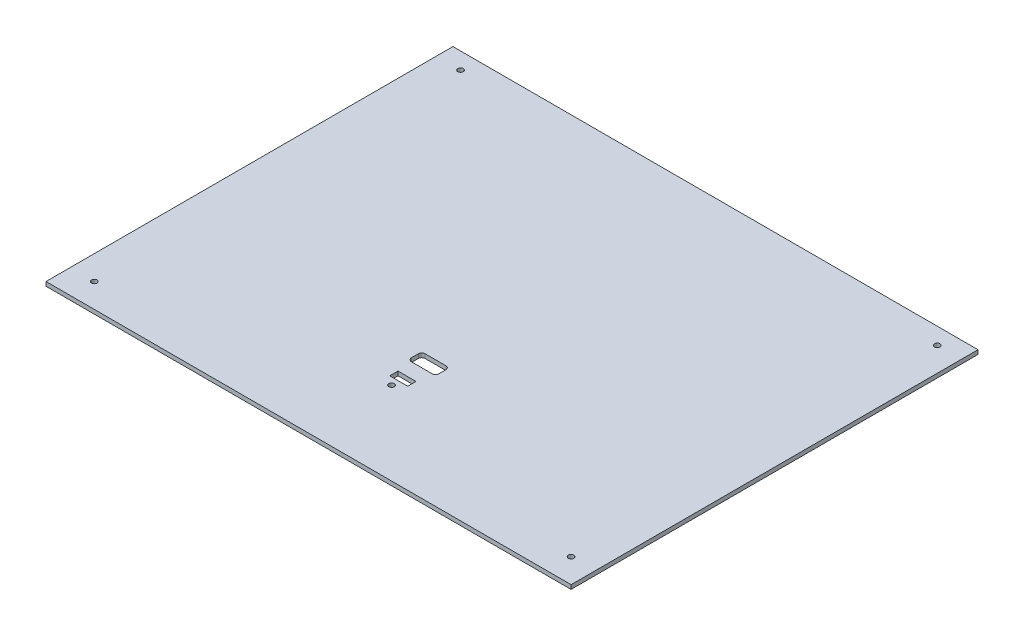
ISO-10303-21;
HEADER;
FILE_DESCRIPTION(('STEP AP214'),'2;1');
FILE_NAME('part.step','',(''),(''),'','','');
FILE_SCHEMA(('AUTOMOTIVE_DESIGN { 1 0 10303 214 1 1 1 1 }'));
ENDSEC;
DATA;
#1=APPLICATION_CONTEXT('core data for automotive mechanical design processes');
#2=APPLICATION_PROTOCOL_DEFINITION('international standard','automotive_design',2000,#1);
#3=PRODUCT_CONTEXT('',#1,'mechanical');
#4=PRODUCT('Part','Part','',(#3));
#5=PRODUCT_RELATED_PRODUCT_CATEGORY('part','',(#4));
#6=PRODUCT_DEFINITION_FORMATION('','',#4);
#7=PRODUCT_DEFINITION_CONTEXT('part definition',#1,'design');
#8=PRODUCT_DEFINITION('design','',#6,#7);
#9=PRODUCT_DEFINITION_SHAPE('','',#8);
#10=(LENGTH_UNIT() NAMED_UNIT(*) SI_UNIT(.MILLI.,.METRE.));
#11=(NAMED_UNIT(*) PLANE_ANGLE_UNIT() SI_UNIT($,.RADIAN.));
#12=(NAMED_UNIT(*) SI_UNIT($,.STERADIAN.) SOLID_ANGLE_UNIT());
#13=UNCERTAINTY_MEASURE_WITH_UNIT(LENGTH_MEASURE(1.E-05),#10,'distance_accuracy_value','');
#14=(GEOMETRIC_REPRESENTATION_CONTEXT(3) GLOBAL_UNCERTAINTY_ASSIGNED_CONTEXT((#13)) GLOBAL_UNIT_ASSIGNED_CONTEXT((#10,
#11,#12)) REPRESENTATION_CONTEXT('',''));
#15=CARTESIAN_POINT('',(0.,0.,0.));
#16=DIRECTION('',(0.,0.,1.));
#17=DIRECTION('',(1.,0.,0.));
#18=AXIS2_PLACEMENT_3D('',#15,#16,#17);
#19=CARTESIAN_POINT('',(-190.,3.,147.25));
#20=DIRECTION('',(1.,0.,0.));
#21=DIRECTION('',(0.,0.,-1.));
#22=AXIS2_PLACEMENT_3D('',#19,#20,#21);
#23=PLANE('',#22);
#24=DIRECTION('',(0.,0.,1.));
#25=VECTOR('',#24,1.);
#26=CARTESIAN_POINT('',(-190.,0.,147.25));
#27=LINE('',#26,#25);
#28=CARTESIAN_POINT('',(-190.,0.,-147.25));
#29=VERTEX_POINT('',#28);
#30=CARTESIAN_POINT('',(-190.,0.,147.25));
#31=VERTEX_POINT('',#30);
#32=EDGE_CURVE('E234',#29,#31,#27,.T.);
#33=ORIENTED_EDGE('',*,*,#32,.T.);
#34=DIRECTION('',(0.,-1.,0.));
#35=VECTOR('',#34,1.);
#36=CARTESIAN_POINT('',(-190.,3.,147.25));
#37=LINE('',#36,#35);
#38=CARTESIAN_POINT('',(-190.,3.,147.25));
#39=VERTEX_POINT('',#38);
#40=EDGE_CURVE('E261',#39,#31,#37,.T.);
#41=ORIENTED_EDGE('',*,*,#40,.F.);
#42=DIRECTION('',(0.,0.,1.));
#43=VECTOR('',#42,1.);
#44=CARTESIAN_POINT('',(-190.,3.,147.25));
#45=LINE('',#44,#43);
#46=CARTESIAN_POINT('',(-190.,3.,-147.25));
#47=VERTEX_POINT('',#46);
#48=EDGE_CURVE('E235',#47,#39,#45,.T.);
#49=ORIENTED_EDGE('',*,*,#48,.F.);
#50=DIRECTION('',(0.,-1.,0.));
#51=VECTOR('',#50,1.);
#52=CARTESIAN_POINT('',(-190.,3.,-147.25));
#53=LINE('',#52,#51);
#54=EDGE_CURVE('E245',#47,#29,#53,.T.);
#55=ORIENTED_EDGE('',*,*,#54,.T.);
#56=EDGE_LOOP('',(#33,#41,#49,#55));
#57=FACE_BOUND('',#56,.T.);
#58=ADVANCED_FACE('F37',(#57),#23,.F.);
#59=CARTESIAN_POINT('',(190.,3.,147.25));
#60=DIRECTION('',(0.,0.,-1.));
#61=DIRECTION('',(-1.,0.,0.));
#62=AXIS2_PLACEMENT_3D('',#59,#60,#61);
#63=PLANE('',#62);
#64=DIRECTION('',(1.,0.,0.));
#65=VECTOR('',#64,1.);
#66=CARTESIAN_POINT('',(190.,0.,147.25));
#67=LINE('',#66,#65);
#68=CARTESIAN_POINT('',(190.,0.,147.25));
#69=VERTEX_POINT('',#68);
#70=EDGE_CURVE('E248',#31,#69,#67,.T.);
#71=ORIENTED_EDGE('',*,*,#70,.T.);
#72=DIRECTION('',(0.,-1.,0.));
#73=VECTOR('',#72,1.);
#74=CARTESIAN_POINT('',(190.,3.,147.25));
#75=LINE('',#74,#73);
#76=CARTESIAN_POINT('',(190.,3.,147.25));
#77=VERTEX_POINT('',#76);
#78=EDGE_CURVE('E258',#77,#69,#75,.T.);
#79=ORIENTED_EDGE('',*,*,#78,.F.);
#80=DIRECTION('',(1.,0.,0.));
#81=VECTOR('',#80,1.);
#82=CARTESIAN_POINT('',(190.,3.,147.25));
#83=LINE('',#82,#81);
#84=EDGE_CURVE('E238',#39,#77,#83,.T.);
#85=ORIENTED_EDGE('',*,*,#84,.F.);
#86=ORIENTED_EDGE('',*,*,#40,.T.);
#87=EDGE_LOOP('',(#71,#79,#85,#86));
#88=FACE_BOUND('',#87,.T.);
#89=ADVANCED_FACE('F339',(#88),#63,.F.);
#90=CARTESIAN_POINT('',(190.,3.,147.25));
#91=DIRECTION('',(-1.,0.,0.));
#92=DIRECTION('',(0.,0.,1.));
#93=AXIS2_PLACEMENT_3D('',#90,#91,#92);
#94=PLANE('',#93);
#95=DIRECTION('',(0.,0.,-1.));
#96=VECTOR('',#95,1.);
#97=CARTESIAN_POINT('',(190.,0.,147.25));
#98=LINE('',#97,#96);
#99=CARTESIAN_POINT('',(190.,0.,-147.25));
#100=VERTEX_POINT('',#99);
#101=EDGE_CURVE('E250',#69,#100,#98,.T.);
#102=ORIENTED_EDGE('',*,*,#101,.T.);
#103=DIRECTION('',(0.,-1.,0.));
#104=VECTOR('',#103,1.);
#105=CARTESIAN_POINT('',(190.,3.,-147.25));
#106=LINE('',#105,#104);
#107=CARTESIAN_POINT('',(190.,3.,-147.25));
#108=VERTEX_POINT('',#107);
#109=EDGE_CURVE('E255',#108,#100,#106,.T.);
#110=ORIENTED_EDGE('',*,*,#109,.F.);
#111=DIRECTION('',(0.,0.,-1.));
#112=VECTOR('',#111,1.);
#113=CARTESIAN_POINT('',(190.,3.,147.25));
#114=LINE('',#113,#112);
#115=EDGE_CURVE('E241',#77,#108,#114,.T.);
#116=ORIENTED_EDGE('',*,*,#115,.F.);
#117=ORIENTED_EDGE('',*,*,#78,.T.);
#118=EDGE_LOOP('',(#102,#110,#116,#117));
#119=FACE_BOUND('',#118,.T.);
#120=ADVANCED_FACE('F344',(#119),#94,.F.);
#121=CARTESIAN_POINT('',(190.,3.,-147.25));
#122=DIRECTION('',(0.,0.,1.));
#123=DIRECTION('',(1.,0.,0.));
#124=AXIS2_PLACEMENT_3D('',#121,#122,#123);
#125=PLANE('',#124);
#126=DIRECTION('',(-1.,0.,0.));
#127=VECTOR('',#126,1.);
#128=CARTESIAN_POINT('',(190.,0.,-147.25));
#129=LINE('',#128,#127);
#130=EDGE_CURVE('E239',#100,#29,#129,.T.);
#131=ORIENTED_EDGE('',*,*,#130,.T.);
#132=ORIENTED_EDGE('',*,*,#54,.F.);
#133=DIRECTION('',(-1.,0.,0.));
#134=VECTOR('',#133,1.);
#135=CARTESIAN_POINT('',(190.,3.,-147.25));
#136=LINE('',#135,#134);
#137=EDGE_CURVE('E243',#108,#47,#136,.T.);
#138=ORIENTED_EDGE('',*,*,#137,.F.);
#139=ORIENTED_EDGE('',*,*,#109,.T.);
#140=EDGE_LOOP('',(#131,#132,#138,#139));
#141=FACE_BOUND('',#140,.T.);
#142=ADVANCED_FACE('F350',(#141),#125,.F.);
#143=CARTESIAN_POINT('',(0.,3.,0.));
#144=DIRECTION('',(0.,1.,0.));
#145=DIRECTION('',(0.,0.,1.));
#146=AXIS2_PLACEMENT_3D('',#143,#144,#145);
#147=PLANE('',#146);
#148=CARTESIAN_POINT('',(-172.5,3.,129.75));
#149=DIRECTION('',(0.,1.,0.));
#150=DIRECTION('',(0.,0.,-1.));
#151=AXIS2_PLACEMENT_3D('',#148,#149,#150);
#152=CIRCLE('',#151,2.);
#153=CARTESIAN_POINT('',(-172.5,3.,127.75));
#154=VERTEX_POINT('',#153);
#155=EDGE_CURVE('E206',#154,#154,#152,.T.);
#156=ORIENTED_EDGE('',*,*,#155,.F.);
#157=EDGE_LOOP('',(#156));
#158=FACE_BOUND('',#157,.T.);
#159=CARTESIAN_POINT('',(172.5,3.,129.75));
#160=DIRECTION('',(0.,1.,0.));
#161=DIRECTION('',(0.,0.,1.));
#162=AXIS2_PLACEMENT_3D('',#159,#160,#161);
#163=CIRCLE('',#162,2.);
#164=CARTESIAN_POINT('',(172.5,3.,131.75));
#165=VERTEX_POINT('',#164);
#166=EDGE_CURVE('E207',#165,#165,#163,.T.);
#167=ORIENTED_EDGE('',*,*,#166,.F.);
#168=EDGE_LOOP('',(#167));
#169=FACE_BOUND('',#168,.T.);
#170=CARTESIAN_POINT('',(172.5,3.,-135.25));
#171=DIRECTION('',(0.,1.,0.));
#172=DIRECTION('',(0.,0.,-1.));
#173=AXIS2_PLACEMENT_3D('',#170,#171,#172);
#174=CIRCLE('',#173,2.);
#175=CARTESIAN_POINT('',(172.5,3.,-137.25));
#176=VERTEX_POINT('',#175);
#177=EDGE_CURVE('E214',#176,#176,#174,.T.);
#178=ORIENTED_EDGE('',*,*,#177,.F.);
#179=EDGE_LOOP('',(#178));
#180=FACE_BOUND('',#179,.T.);
#181=CARTESIAN_POINT('',(0.,3.,87.1499999999999));
#182=DIRECTION('',(0.,1.,0.));
#183=DIRECTION('',(0.,0.,1.));
#184=AXIS2_PLACEMENT_3D('',#181,#182,#183);
#185=CIRCLE('',#184,2.00000000000001);
#186=CARTESIAN_POINT('',(0.,3.,89.1499999999999));
#187=VERTEX_POINT('',#186);
#188=EDGE_CURVE('E220',#187,#187,#185,.T.);
#189=ORIENTED_EDGE('',*,*,#188,.F.);
#190=EDGE_LOOP('',(#189));
#191=FACE_BOUND('',#190,.T.);
#192=DIRECTION('',(0.,0.,1.));
#193=VECTOR('',#192,1.);
#194=CARTESIAN_POINT('',(-6.50000000000001,3.,76.));
#195=LINE('',#194,#193);
#196=CARTESIAN_POINT('',(-6.50000000000001,3.,76.));
#197=VERTEX_POINT('',#196);
#198=CARTESIAN_POINT('',(-6.50000000000001,3.,82.));
#199=VERTEX_POINT('',#198);
#200=EDGE_CURVE('E226',#197,#199,#195,.T.);
#201=ORIENTED_EDGE('',*,*,#200,.F.);
#202=DIRECTION('',(-1.,0.,0.));
#203=VECTOR('',#202,1.);
#204=CARTESIAN_POINT('',(6.49999999999999,3.,76.));
#205=LINE('',#204,#203);
#206=CARTESIAN_POINT('',(6.49999999999999,3.,76.));
#207=VERTEX_POINT('',#206);
#208=EDGE_CURVE('E167',#207,#197,#205,.T.);
#209=ORIENTED_EDGE('',*,*,#208,.F.);
#210=DIRECTION('',(0.,0.,-1.));
#211=VECTOR('',#210,1.);
#212=CARTESIAN_POINT('',(6.49999999999999,3.,76.));
#213=LINE('',#212,#211);
#214=CARTESIAN_POINT('',(6.49999999999999,3.,82.));
#215=VERTEX_POINT('',#214);
#216=EDGE_CURVE('E586',#215,#207,#213,.T.);
#217=ORIENTED_EDGE('',*,*,#216,.F.);
#218=DIRECTION('',(1.,0.,0.));
#219=VECTOR('',#218,1.);
#220=CARTESIAN_POINT('',(6.49999999999999,3.,82.));
#221=LINE('',#220,#219);
#222=EDGE_CURVE('E589',#199,#215,#221,.T.);
#223=ORIENTED_EDGE('',*,*,#222,.F.);
#224=EDGE_LOOP('',(#201,#209,#217,#223));
#225=FACE_BOUND('',#224,.T.);
#226=DIRECTION('',(0.,0.,1.));
#227=VECTOR('',#226,1.);
#228=CARTESIAN_POINT('',(-9.99999999999999,3.,55.3373810908357));
#229=LINE('',#228,#227);
#230=CARTESIAN_POINT('',(-9.99999999999999,3.,57.8373810908357));
#231=VERTEX_POINT('',#230);
#232=CARTESIAN_POINT('',(-9.99999999999999,3.,62.8373810908357));
#233=VERTEX_POINT('',#232);
#234=EDGE_CURVE('E194',#231,#233,#229,.T.);
#235=ORIENTED_EDGE('',*,*,#234,.F.);
#236=CARTESIAN_POINT('',(-7.49999999999999,3.,57.8373810908357));
#237=DIRECTION('',(0.,1.,0.));
#238=DIRECTION('',(0.,0.,1.));
#239=AXIS2_PLACEMENT_3D('',#236,#237,#238);
#240=CIRCLE('',#239,2.5);
#241=CARTESIAN_POINT('',(-7.49999999999999,3.,55.3373810908357));
#242=VERTEX_POINT('',#241);
#243=EDGE_CURVE('E45',#231,#242,#240,.F.);
#244=ORIENTED_EDGE('',*,*,#243,.T.);
#245=DIRECTION('',(-1.,0.,0.));
#246=VECTOR('',#245,1.);
#247=CARTESIAN_POINT('',(10.,3.,55.3373810908357));
#248=LINE('',#247,#246);
#249=CARTESIAN_POINT('',(7.50000000000001,3.,55.3373810908357));
#250=VERTEX_POINT('',#249);
#251=EDGE_CURVE('E184',#250,#242,#248,.T.);
#252=ORIENTED_EDGE('',*,*,#251,.F.);
#253=CARTESIAN_POINT('',(7.50000000000001,3.,57.8373810908357));
#254=DIRECTION('',(0.,1.,0.));
#255=DIRECTION('',(0.,0.,1.));
#256=AXIS2_PLACEMENT_3D('',#253,#254,#255);
#257=CIRCLE('',#256,2.5);
#258=CARTESIAN_POINT('',(10.,3.,57.8373810908357));
#259=VERTEX_POINT('',#258);
#260=EDGE_CURVE('E283',#250,#259,#257,.F.);
#261=ORIENTED_EDGE('',*,*,#260,.T.);
#262=DIRECTION('',(0.,0.,-1.));
#263=VECTOR('',#262,1.);
#264=CARTESIAN_POINT('',(10.,3.,55.3373810908357));
#265=LINE('',#264,#263);
#266=CARTESIAN_POINT('',(10.,3.,62.8373810908357));
#267=VERTEX_POINT('',#266);
#268=EDGE_CURVE('E187',#267,#259,#265,.T.);
#269=ORIENTED_EDGE('',*,*,#268,.F.);
#270=CARTESIAN_POINT('',(7.50000000000001,3.,62.8373810908357));
#271=DIRECTION('',(0.,1.,0.));
#272=DIRECTION('',(0.,0.,1.));
#273=AXIS2_PLACEMENT_3D('',#270,#271,#272);
#274=CIRCLE('',#273,2.5);
#275=CARTESIAN_POINT('',(7.50000000000001,3.,65.3373810908357));
#276=VERTEX_POINT('',#275);
#277=EDGE_CURVE('E287',#267,#276,#274,.F.);
#278=ORIENTED_EDGE('',*,*,#277,.T.);
#279=DIRECTION('',(1.,0.,0.));
#280=VECTOR('',#279,1.);
#281=CARTESIAN_POINT('',(10.,3.,65.3373810908357));
#282=LINE('',#281,#280);
#283=CARTESIAN_POINT('',(-7.49999999999999,3.,65.3373810908357));
#284=VERTEX_POINT('',#283);
#285=EDGE_CURVE('E191',#284,#276,#282,.T.);
#286=ORIENTED_EDGE('',*,*,#285,.F.);
#287=CARTESIAN_POINT('',(-7.49999999999999,3.,62.8373810908357));
#288=DIRECTION('',(0.,1.,0.));
#289=DIRECTION('',(0.,0.,1.));
#290=AXIS2_PLACEMENT_3D('',#287,#288,#289);
#291=CIRCLE('',#290,2.5);
#292=EDGE_CURVE('E52',#284,#233,#291,.F.);
#293=ORIENTED_EDGE('',*,*,#292,.T.);
#294=EDGE_LOOP('',(#235,#244,#252,#261,#269,#278,#286,#293));
#295=FACE_BOUND('',#294,.T.);
#296=CARTESIAN_POINT('',(-172.5,3.,-135.25));
#297=DIRECTION('',(0.,1.,0.));
#298=DIRECTION('',(0.,0.,1.));
#299=AXIS2_PLACEMENT_3D('',#296,#297,#298);
#300=CIRCLE('',#299,2.);
#301=CARTESIAN_POINT('',(-172.5,3.,-133.25));
#302=VERTEX_POINT('',#301);
#303=EDGE_CURVE('E210',#302,#302,#300,.T.);
#304=ORIENTED_EDGE('',*,*,#303,.F.);
#305=EDGE_LOOP('',(#304));
#306=FACE_BOUND('',#305,.T.);
#307=ORIENTED_EDGE('',*,*,#48,.T.);
#308=ORIENTED_EDGE('',*,*,#84,.T.);
#309=ORIENTED_EDGE('',*,*,#115,.T.);
#310=ORIENTED_EDGE('',*,*,#137,.T.);
#311=EDGE_LOOP('',(#307,#308,#309,#310));
#312=FACE_BOUND('',#311,.T.);
#313=ADVANCED_FACE('F294',(#158,#169,#180,#191,#225,#295,#306,#312),#147,.T.);
#314=CARTESIAN_POINT('',(0.,0.,0.));
#315=DIRECTION('',(0.,1.,0.));
#316=DIRECTION('',(0.,0.,1.));
#317=AXIS2_PLACEMENT_3D('',#314,#315,#316);
#318=PLANE('',#317);
#319=CARTESIAN_POINT('',(-172.5,0.,129.75));
#320=DIRECTION('',(0.,1.,0.));
#321=DIRECTION('',(0.,0.,1.));
#322=AXIS2_PLACEMENT_3D('',#319,#320,#321);
#323=CIRCLE('',#322,2.);
#324=CARTESIAN_POINT('',(-172.5,0.,131.75));
#325=VERTEX_POINT('',#324);
#326=EDGE_CURVE('E203',#325,#325,#323,.F.);
#327=ORIENTED_EDGE('',*,*,#326,.F.);
#328=EDGE_LOOP('',(#327));
#329=FACE_BOUND('',#328,.T.);
#330=CARTESIAN_POINT('',(172.5,0.,129.75));
#331=DIRECTION('',(0.,1.,0.));
#332=DIRECTION('',(0.,0.,1.));
#333=AXIS2_PLACEMENT_3D('',#330,#331,#332);
#334=CIRCLE('',#333,2.);
#335=CARTESIAN_POINT('',(172.5,0.,131.75));
#336=VERTEX_POINT('',#335);
#337=EDGE_CURVE('E211',#336,#336,#334,.F.);
#338=ORIENTED_EDGE('',*,*,#337,.F.);
#339=EDGE_LOOP('',(#338));
#340=FACE_BOUND('',#339,.T.);
#341=CARTESIAN_POINT('',(172.5,0.,-135.25));
#342=DIRECTION('',(0.,1.,0.));
#343=DIRECTION('',(0.,0.,1.));
#344=AXIS2_PLACEMENT_3D('',#341,#342,#343);
#345=CIRCLE('',#344,2.);
#346=CARTESIAN_POINT('',(172.5,0.,-133.25));
#347=VERTEX_POINT('',#346);
#348=EDGE_CURVE('E217',#347,#347,#345,.F.);
#349=ORIENTED_EDGE('',*,*,#348,.F.);
#350=EDGE_LOOP('',(#349));
#351=FACE_BOUND('',#350,.T.);
#352=CARTESIAN_POINT('',(0.,0.,87.1499999999999));
#353=DIRECTION('',(0.,1.,0.));
#354=DIRECTION('',(0.,0.,1.));
#355=AXIS2_PLACEMENT_3D('',#352,#353,#354);
#356=CIRCLE('',#355,2.00000000000001);
#357=CARTESIAN_POINT('',(0.,0.,89.1499999999999));
#358=VERTEX_POINT('',#357);
#359=EDGE_CURVE('E223',#358,#358,#356,.F.);
#360=ORIENTED_EDGE('',*,*,#359,.F.);
#361=EDGE_LOOP('',(#360));
#362=FACE_BOUND('',#361,.T.);
#363=DIRECTION('',(1.,0.,0.));
#364=VECTOR('',#363,1.);
#365=CARTESIAN_POINT('',(6.49999999999999,0.,76.));
#366=LINE('',#365,#364);
#367=CARTESIAN_POINT('',(-6.50000000000001,0.,76.));
#368=VERTEX_POINT('',#367);
#369=CARTESIAN_POINT('',(6.49999999999999,0.,76.));
#370=VERTEX_POINT('',#369);
#371=EDGE_CURVE('E160',#368,#370,#366,.T.);
#372=ORIENTED_EDGE('',*,*,#371,.F.);
#373=DIRECTION('',(0.,0.,-1.));
#374=VECTOR('',#373,1.);
#375=CARTESIAN_POINT('',(-6.50000000000001,0.,76.));
#376=LINE('',#375,#374);
#377=CARTESIAN_POINT('',(-6.50000000000001,0.,81.9999999999999));
#378=VERTEX_POINT('',#377);
#379=EDGE_CURVE('E150',#378,#368,#376,.T.);
#380=ORIENTED_EDGE('',*,*,#379,.F.);
#381=DIRECTION('',(-1.,0.,0.));
#382=VECTOR('',#381,1.);
#383=CARTESIAN_POINT('',(6.49999999999999,0.,82.));
#384=LINE('',#383,#382);
#385=CARTESIAN_POINT('',(6.49999999999999,0.,82.));
#386=VERTEX_POINT('',#385);
#387=EDGE_CURVE('E161',#386,#378,#384,.T.);
#388=ORIENTED_EDGE('',*,*,#387,.F.);
#389=DIRECTION('',(0.,0.,1.));
#390=VECTOR('',#389,1.);
#391=CARTESIAN_POINT('',(6.49999999999999,0.,76.));
#392=LINE('',#391,#390);
#393=EDGE_CURVE('E170',#370,#386,#392,.T.);
#394=ORIENTED_EDGE('',*,*,#393,.F.);
#395=EDGE_LOOP('',(#372,#380,#388,#394));
#396=FACE_BOUND('',#395,.T.);
#397=DIRECTION('',(1.,0.,0.));
#398=VECTOR('',#397,1.);
#399=CARTESIAN_POINT('',(10.,0.,55.3373810908357));
#400=LINE('',#399,#398);
#401=CARTESIAN_POINT('',(-7.49999999999999,0.,55.3373810908357));
#402=VERTEX_POINT('',#401);
#403=CARTESIAN_POINT('',(7.50000000000001,0.,55.3373810908357));
#404=VERTEX_POINT('',#403);
#405=EDGE_CURVE('E198',#402,#404,#400,.T.);
#406=ORIENTED_EDGE('',*,*,#405,.F.);
#407=CARTESIAN_POINT('',(-7.49999999999999,0.,57.8373810908357));
#408=DIRECTION('',(0.,1.,0.));
#409=DIRECTION('',(0.,0.,1.));
#410=AXIS2_PLACEMENT_3D('',#407,#408,#409);
#411=CIRCLE('',#410,2.5);
#412=CARTESIAN_POINT('',(-9.99999999999999,0.,57.8373810908357));
#413=VERTEX_POINT('',#412);
#414=EDGE_CURVE('E11',#402,#413,#411,.T.);
#415=ORIENTED_EDGE('',*,*,#414,.T.);
#416=DIRECTION('',(0.,0.,-1.));
#417=VECTOR('',#416,1.);
#418=CARTESIAN_POINT('',(-9.99999999999999,0.,55.3373810908357));
#419=LINE('',#418,#417);
#420=CARTESIAN_POINT('',(-9.99999999999999,0.,62.8373810908357));
#421=VERTEX_POINT('',#420);
#422=EDGE_CURVE('E183',#421,#413,#419,.T.);
#423=ORIENTED_EDGE('',*,*,#422,.F.);
#424=CARTESIAN_POINT('',(-7.49999999999999,0.,62.8373810908357));
#425=DIRECTION('',(0.,1.,0.));
#426=DIRECTION('',(0.,0.,1.));
#427=AXIS2_PLACEMENT_3D('',#424,#425,#426);
#428=CIRCLE('',#427,2.5);
#429=CARTESIAN_POINT('',(-7.49999999999999,0.,65.3373810908357));
#430=VERTEX_POINT('',#429);
#431=EDGE_CURVE('E292',#421,#430,#428,.T.);
#432=ORIENTED_EDGE('',*,*,#431,.T.);
#433=DIRECTION('',(-1.,0.,0.));
#434=VECTOR('',#433,1.);
#435=CARTESIAN_POINT('',(10.,0.,65.3373810908357));
#436=LINE('',#435,#434);
#437=CARTESIAN_POINT('',(7.50000000000001,0.,65.3373810908357));
#438=VERTEX_POINT('',#437);
#439=EDGE_CURVE('E180',#438,#430,#436,.T.);
#440=ORIENTED_EDGE('',*,*,#439,.F.);
#441=CARTESIAN_POINT('',(7.50000000000001,0.,62.8373810908357));
#442=DIRECTION('',(0.,1.,0.));
#443=DIRECTION('',(0.,0.,1.));
#444=AXIS2_PLACEMENT_3D('',#441,#442,#443);
#445=CIRCLE('',#444,2.5);
#446=CARTESIAN_POINT('',(10.,0.,62.8373810908357));
#447=VERTEX_POINT('',#446);
#448=EDGE_CURVE('E289',#438,#447,#445,.T.);
#449=ORIENTED_EDGE('',*,*,#448,.T.);
#450=DIRECTION('',(0.,0.,1.));
#451=VECTOR('',#450,1.);
#452=CARTESIAN_POINT('',(10.,0.,55.3373810908357));
#453=LINE('',#452,#451);
#454=CARTESIAN_POINT('',(10.,0.,57.8373810908357));
#455=VERTEX_POINT('',#454);
#456=EDGE_CURVE('E188',#455,#447,#453,.T.);
#457=ORIENTED_EDGE('',*,*,#456,.F.);
#458=CARTESIAN_POINT('',(7.50000000000001,0.,57.8373810908357));
#459=DIRECTION('',(0.,1.,0.));
#460=DIRECTION('',(0.,0.,1.));
#461=AXIS2_PLACEMENT_3D('',#458,#459,#460);
#462=CIRCLE('',#461,2.5);
#463=EDGE_CURVE('E285',#455,#404,#462,.T.);
#464=ORIENTED_EDGE('',*,*,#463,.T.);
#465=EDGE_LOOP('',(#406,#415,#423,#432,#440,#449,#457,#464));
#466=FACE_BOUND('',#465,.T.);
#467=CARTESIAN_POINT('',(-172.5,0.,-135.25));
#468=DIRECTION('',(0.,1.,0.));
#469=DIRECTION('',(0.,0.,1.));
#470=AXIS2_PLACEMENT_3D('',#467,#468,#469);
#471=CIRCLE('',#470,2.);
#472=CARTESIAN_POINT('',(-172.5,0.,-133.25));
#473=VERTEX_POINT('',#472);
#474=EDGE_CURVE('E231',#473,#473,#471,.F.);
#475=ORIENTED_EDGE('',*,*,#474,.F.);
#476=EDGE_LOOP('',(#475));
#477=FACE_BOUND('',#476,.T.);
#478=ORIENTED_EDGE('',*,*,#32,.F.);
#479=ORIENTED_EDGE('',*,*,#130,.F.);
#480=ORIENTED_EDGE('',*,*,#101,.F.);
#481=ORIENTED_EDGE('',*,*,#70,.F.);
#482=EDGE_LOOP('',(#478,#479,#480,#481));
#483=FACE_BOUND('',#482,.T.);
#484=ADVANCED_FACE('F173',(#329,#340,#351,#362,#396,#466,#477,#483),#318,.F.);
#485=CARTESIAN_POINT('',(-172.5,-22.3606797749979,-135.25));
#486=DIRECTION('',(0.,1.,0.));
#487=DIRECTION('',(0.,0.,1.));
#488=AXIS2_PLACEMENT_3D('',#485,#486,#487);
#489=CYLINDRICAL_SURFACE('',#488,2.);
#490=ORIENTED_EDGE('',*,*,#474,.T.);
#491=EDGE_LOOP('',(#490));
#492=FACE_BOUND('',#491,.T.);
#493=ORIENTED_EDGE('',*,*,#303,.T.);
#494=EDGE_LOOP('',(#493));
#495=FACE_BOUND('',#494,.T.);
#496=ADVANCED_FACE('F357',(#492,#495),#489,.F.);
#497=CARTESIAN_POINT('',(-9.99999999999999,-22.3606797749979,55.3373810908357));
#498=DIRECTION('',(-1.,0.,0.));
#499=DIRECTION('',(0.,0.,1.));
#500=AXIS2_PLACEMENT_3D('',#497,#498,#499);
#501=PLANE('',#500);
#502=ORIENTED_EDGE('',*,*,#234,.T.);
#503=DIRECTION('',(0.,1.,0.));
#504=VECTOR('',#503,1.);
#505=CARTESIAN_POINT('',(-9.99999999999999,0.,62.8373810908357));
#506=LINE('',#505,#504);
#507=EDGE_CURVE('E281',#233,#421,#506,.F.);
#508=ORIENTED_EDGE('',*,*,#507,.T.);
#509=ORIENTED_EDGE('',*,*,#422,.T.);
#510=DIRECTION('',(0.,1.,0.));
#511=VECTOR('',#510,1.);
#512=CARTESIAN_POINT('',(-9.99999999999999,3.,57.8373810908357));
#513=LINE('',#512,#511);
#514=EDGE_CURVE('E279',#413,#231,#513,.T.);
#515=ORIENTED_EDGE('',*,*,#514,.T.);
#516=EDGE_LOOP('',(#502,#508,#509,#515));
#517=FACE_BOUND('',#516,.T.);
#518=ADVANCED_FACE('F305',(#517),#501,.F.);
#519=CARTESIAN_POINT('',(10.,-22.3606797749979,55.3373810908357));
#520=DIRECTION('',(0.,0.,-1.));
#521=DIRECTION('',(-1.,0.,0.));
#522=AXIS2_PLACEMENT_3D('',#519,#520,#521);
#523=PLANE('',#522);
#524=ORIENTED_EDGE('',*,*,#405,.T.);
#525=DIRECTION('',(0.,1.,0.));
#526=VECTOR('',#525,1.);
#527=CARTESIAN_POINT('',(7.50000000000001,3.,55.3373810908357));
#528=LINE('',#527,#526);
#529=EDGE_CURVE('E266',#404,#250,#528,.T.);
#530=ORIENTED_EDGE('',*,*,#529,.T.);
#531=ORIENTED_EDGE('',*,*,#251,.T.);
#532=DIRECTION('',(0.,1.,0.));
#533=VECTOR('',#532,1.);
#534=CARTESIAN_POINT('',(-7.49999999999999,0.,55.3373810908357));
#535=LINE('',#534,#533);
#536=EDGE_CURVE('E264',#242,#402,#535,.F.);
#537=ORIENTED_EDGE('',*,*,#536,.T.);
#538=EDGE_LOOP('',(#524,#530,#531,#537));
#539=FACE_BOUND('',#538,.T.);
#540=ADVANCED_FACE('F297',(#539),#523,.F.);
#541=CARTESIAN_POINT('',(10.,-22.3606797749979,55.3373810908357));
#542=DIRECTION('',(1.,0.,0.));
#543=DIRECTION('',(0.,0.,-1.));
#544=AXIS2_PLACEMENT_3D('',#541,#542,#543);
#545=PLANE('',#544);
#546=ORIENTED_EDGE('',*,*,#268,.T.);
#547=DIRECTION('',(0.,1.,0.));
#548=VECTOR('',#547,1.);
#549=CARTESIAN_POINT('',(10.,0.,57.8373810908357));
#550=LINE('',#549,#548);
#551=EDGE_CURVE('E272',#259,#455,#550,.F.);
#552=ORIENTED_EDGE('',*,*,#551,.T.);
#553=ORIENTED_EDGE('',*,*,#456,.T.);
#554=DIRECTION('',(0.,1.,0.));
#555=VECTOR('',#554,1.);
#556=CARTESIAN_POINT('',(10.,3.,62.8373810908357));
#557=LINE('',#556,#555);
#558=EDGE_CURVE('E269',#447,#267,#557,.T.);
#559=ORIENTED_EDGE('',*,*,#558,.T.);
#560=EDGE_LOOP('',(#546,#552,#553,#559));
#561=FACE_BOUND('',#560,.T.);
#562=ADVANCED_FACE('F321',(#561),#545,.F.);
#563=CARTESIAN_POINT('',(10.,-22.3606797749979,65.3373810908357));
#564=DIRECTION('',(0.,0.,1.));
#565=DIRECTION('',(1.,0.,0.));
#566=AXIS2_PLACEMENT_3D('',#563,#564,#565);
#567=PLANE('',#566);
#568=ORIENTED_EDGE('',*,*,#285,.T.);
#569=DIRECTION('',(0.,1.,0.));
#570=VECTOR('',#569,1.);
#571=CARTESIAN_POINT('',(7.50000000000001,0.,65.3373810908357));
#572=LINE('',#571,#570);
#573=EDGE_CURVE('E277',#276,#438,#572,.F.);
#574=ORIENTED_EDGE('',*,*,#573,.T.);
#575=ORIENTED_EDGE('',*,*,#439,.T.);
#576=DIRECTION('',(0.,1.,0.));
#577=VECTOR('',#576,1.);
#578=CARTESIAN_POINT('',(-7.49999999999999,3.,65.3373810908357));
#579=LINE('',#578,#577);
#580=EDGE_CURVE('E274',#430,#284,#579,.T.);
#581=ORIENTED_EDGE('',*,*,#580,.T.);
#582=EDGE_LOOP('',(#568,#574,#575,#581));
#583=FACE_BOUND('',#582,.T.);
#584=ADVANCED_FACE('F313',(#583),#567,.F.);
#585=CARTESIAN_POINT('',(-6.50000000000001,-22.3606797749979,76.));
#586=DIRECTION('',(-1.,0.,0.));
#587=DIRECTION('',(0.,0.,1.));
#588=AXIS2_PLACEMENT_3D('',#585,#586,#587);
#589=PLANE('',#588);
#590=ORIENTED_EDGE('',*,*,#379,.T.);
#591=DIRECTION('',(0.,1.,0.));
#592=VECTOR('',#591,1.);
#593=CARTESIAN_POINT('',(-6.50000000000001,-22.3606797749979,76.));
#594=LINE('',#593,#592);
#595=EDGE_CURVE('E153',#368,#197,#594,.T.);
#596=ORIENTED_EDGE('',*,*,#595,.T.);
#597=ORIENTED_EDGE('',*,*,#200,.T.);
#598=DIRECTION('',(0.,1.,0.));
#599=VECTOR('',#598,1.);
#600=CARTESIAN_POINT('',(-6.50000000000001,-22.3606797749979,81.9999999999999));
#601=LINE('',#600,#599);
#602=EDGE_CURVE('E156',#378,#199,#601,.T.);
#603=ORIENTED_EDGE('',*,*,#602,.F.);
#604=EDGE_LOOP('',(#590,#596,#597,#603));
#605=FACE_BOUND('',#604,.T.);
#606=ADVANCED_FACE('F152',(#605),#589,.F.);
#607=CARTESIAN_POINT('',(6.49999999999999,-22.3606797749979,76.));
#608=DIRECTION('',(0.,0.,-1.));
#609=DIRECTION('',(-1.,0.,0.));
#610=AXIS2_PLACEMENT_3D('',#607,#608,#609);
#611=PLANE('',#610);
#612=ORIENTED_EDGE('',*,*,#371,.T.);
#613=DIRECTION('',(0.,1.,0.));
#614=VECTOR('',#613,1.);
#615=CARTESIAN_POINT('',(6.49999999999999,-22.3606797749979,76.));
#616=LINE('',#615,#614);
#617=EDGE_CURVE('E169',#370,#207,#616,.T.);
#618=ORIENTED_EDGE('',*,*,#617,.T.);
#619=ORIENTED_EDGE('',*,*,#208,.T.);
#620=ORIENTED_EDGE('',*,*,#595,.F.);
#621=EDGE_LOOP('',(#612,#618,#619,#620));
#622=FACE_BOUND('',#621,.T.);
#623=ADVANCED_FACE('F164',(#622),#611,.F.);
#624=CARTESIAN_POINT('',(6.49999999999999,-22.3606797749979,76.));
#625=DIRECTION('',(1.,0.,0.));
#626=DIRECTION('',(0.,0.,-1.));
#627=AXIS2_PLACEMENT_3D('',#624,#625,#626);
#628=PLANE('',#627);
#629=ORIENTED_EDGE('',*,*,#393,.T.);
#630=DIRECTION('',(0.,1.,0.));
#631=VECTOR('',#630,1.);
#632=CARTESIAN_POINT('',(6.49999999999999,-22.3606797749979,82.));
#633=LINE('',#632,#631);
#634=EDGE_CURVE('E579',#386,#215,#633,.T.);
#635=ORIENTED_EDGE('',*,*,#634,.T.);
#636=ORIENTED_EDGE('',*,*,#216,.T.);
#637=ORIENTED_EDGE('',*,*,#617,.F.);
#638=EDGE_LOOP('',(#629,#635,#636,#637));
#639=FACE_BOUND('',#638,.T.);
#640=ADVANCED_FACE('F387',(#639),#628,.F.);
#641=CARTESIAN_POINT('',(6.49999999999999,-22.3606797749979,82.));
#642=DIRECTION('',(0.,0.,1.));
#643=DIRECTION('',(1.,0.,0.));
#644=AXIS2_PLACEMENT_3D('',#641,#642,#643);
#645=PLANE('',#644);
#646=ORIENTED_EDGE('',*,*,#387,.T.);
#647=ORIENTED_EDGE('',*,*,#602,.T.);
#648=ORIENTED_EDGE('',*,*,#222,.T.);
#649=ORIENTED_EDGE('',*,*,#634,.F.);
#650=EDGE_LOOP('',(#646,#647,#648,#649));
#651=FACE_BOUND('',#650,.T.);
#652=ADVANCED_FACE('F369',(#651),#645,.F.);
#653=CARTESIAN_POINT('',(0.,-22.3606797749979,87.1499999999999));
#654=DIRECTION('',(0.,1.,0.));
#655=DIRECTION('',(0.,0.,1.));
#656=AXIS2_PLACEMENT_3D('',#653,#654,#655);
#657=CYLINDRICAL_SURFACE('',#656,2.00000000000001);
#658=ORIENTED_EDGE('',*,*,#359,.T.);
#659=EDGE_LOOP('',(#658));
#660=FACE_BOUND('',#659,.T.);
#661=ORIENTED_EDGE('',*,*,#188,.T.);
#662=EDGE_LOOP('',(#661));
#663=FACE_BOUND('',#662,.T.);
#664=ADVANCED_FACE('F365',(#660,#663),#657,.F.);
#665=CARTESIAN_POINT('',(172.5,-22.3606797749979,-135.25));
#666=DIRECTION('',(0.,1.,0.));
#667=DIRECTION('',(0.,0.,1.));
#668=AXIS2_PLACEMENT_3D('',#665,#666,#667);
#669=CYLINDRICAL_SURFACE('',#668,2.);
#670=ORIENTED_EDGE('',*,*,#348,.T.);
#671=EDGE_LOOP('',(#670));
#672=FACE_BOUND('',#671,.T.);
#673=ORIENTED_EDGE('',*,*,#177,.T.);
#674=EDGE_LOOP('',(#673));
#675=FACE_BOUND('',#674,.T.);
#676=ADVANCED_FACE('F368',(#672,#675),#669,.F.);
#677=CARTESIAN_POINT('',(172.5,-22.3606797749979,129.75));
#678=DIRECTION('',(0.,1.,0.));
#679=DIRECTION('',(0.,0.,1.));
#680=AXIS2_PLACEMENT_3D('',#677,#678,#679);
#681=CYLINDRICAL_SURFACE('',#680,2.);
#682=ORIENTED_EDGE('',*,*,#337,.T.);
#683=EDGE_LOOP('',(#682));
#684=FACE_BOUND('',#683,.T.);
#685=ORIENTED_EDGE('',*,*,#166,.T.);
#686=EDGE_LOOP('',(#685));
#687=FACE_BOUND('',#686,.T.);
#688=ADVANCED_FACE('F334',(#684,#687),#681,.F.);
#689=CARTESIAN_POINT('',(-172.5,-22.3606797749979,129.75));
#690=DIRECTION('',(0.,1.,0.));
#691=DIRECTION('',(0.,0.,1.));
#692=AXIS2_PLACEMENT_3D('',#689,#690,#691);
#693=CYLINDRICAL_SURFACE('',#692,2.);
#694=ORIENTED_EDGE('',*,*,#326,.T.);
#695=EDGE_LOOP('',(#694));
#696=FACE_BOUND('',#695,.T.);
#697=ORIENTED_EDGE('',*,*,#155,.T.);
#698=EDGE_LOOP('',(#697));
#699=FACE_BOUND('',#698,.T.);
#700=ADVANCED_FACE('F327',(#696,#699),#693,.F.);
#701=CARTESIAN_POINT('',(7.50000000000001,-22.3606797749979,57.8373810908357));
#702=DIRECTION('',(0.,-1.,0.));
#703=DIRECTION('',(0.,0.,-1.));
#704=AXIS2_PLACEMENT_3D('',#701,#702,#703);
#705=CYLINDRICAL_SURFACE('',#704,2.5);
#706=ORIENTED_EDGE('',*,*,#463,.F.);
#707=ORIENTED_EDGE('',*,*,#551,.F.);
#708=ORIENTED_EDGE('',*,*,#260,.F.);
#709=ORIENTED_EDGE('',*,*,#529,.F.);
#710=EDGE_LOOP('',(#706,#707,#708,#709));
#711=FACE_BOUND('',#710,.T.);
#712=ADVANCED_FACE('F325',(#711),#705,.F.);
#713=CARTESIAN_POINT('',(7.50000000000001,-22.3606797749979,62.8373810908357));
#714=DIRECTION('',(0.,-1.,0.));
#715=DIRECTION('',(0.,0.,-1.));
#716=AXIS2_PLACEMENT_3D('',#713,#714,#715);
#717=CYLINDRICAL_SURFACE('',#716,2.5);
#718=ORIENTED_EDGE('',*,*,#448,.F.);
#719=ORIENTED_EDGE('',*,*,#573,.F.);
#720=ORIENTED_EDGE('',*,*,#277,.F.);
#721=ORIENTED_EDGE('',*,*,#558,.F.);
#722=EDGE_LOOP('',(#718,#719,#720,#721));
#723=FACE_BOUND('',#722,.T.);
#724=ADVANCED_FACE('F316',(#723),#717,.F.);
#725=CARTESIAN_POINT('',(-7.49999999999999,-22.3606797749979,62.8373810908357));
#726=DIRECTION('',(0.,-1.,0.));
#727=DIRECTION('',(0.,0.,-1.));
#728=AXIS2_PLACEMENT_3D('',#725,#726,#727);
#729=CYLINDRICAL_SURFACE('',#728,2.5);
#730=ORIENTED_EDGE('',*,*,#431,.F.);
#731=ORIENTED_EDGE('',*,*,#507,.F.);
#732=ORIENTED_EDGE('',*,*,#292,.F.);
#733=ORIENTED_EDGE('',*,*,#580,.F.);
#734=EDGE_LOOP('',(#730,#731,#732,#733));
#735=FACE_BOUND('',#734,.T.);
#736=ADVANCED_FACE('F308',(#735),#729,.F.);
#737=CARTESIAN_POINT('',(-7.49999999999999,-22.3606797749979,57.8373810908357));
#738=DIRECTION('',(0.,-1.,0.));
#739=DIRECTION('',(0.,0.,-1.));
#740=AXIS2_PLACEMENT_3D('',#737,#738,#739);
#741=CYLINDRICAL_SURFACE('',#740,2.5);
#742=ORIENTED_EDGE('',*,*,#414,.F.);
#743=ORIENTED_EDGE('',*,*,#536,.F.);
#744=ORIENTED_EDGE('',*,*,#243,.F.);
#745=ORIENTED_EDGE('',*,*,#514,.F.);
#746=EDGE_LOOP('',(#742,#743,#744,#745));
#747=FACE_BOUND('',#746,.T.);
#748=ADVANCED_FACE('F39',(#747),#741,.F.);
#749=CLOSED_SHELL('',(#58,#89,#120,#142,#313,#484,#496,#518,#540,#562,#584,#606,#623,#640,#652,
#664,#676,#688,#700,#712,#724,#736,#748));
#750=MANIFOLD_SOLID_BREP('B2',#749);
#751=ADVANCED_BREP_SHAPE_REPRESENTATION('',(#18,#750),#14);
#752=SHAPE_DEFINITION_REPRESENTATION(#9,#751);
ENDSEC;
END-ISO-10303-21;
